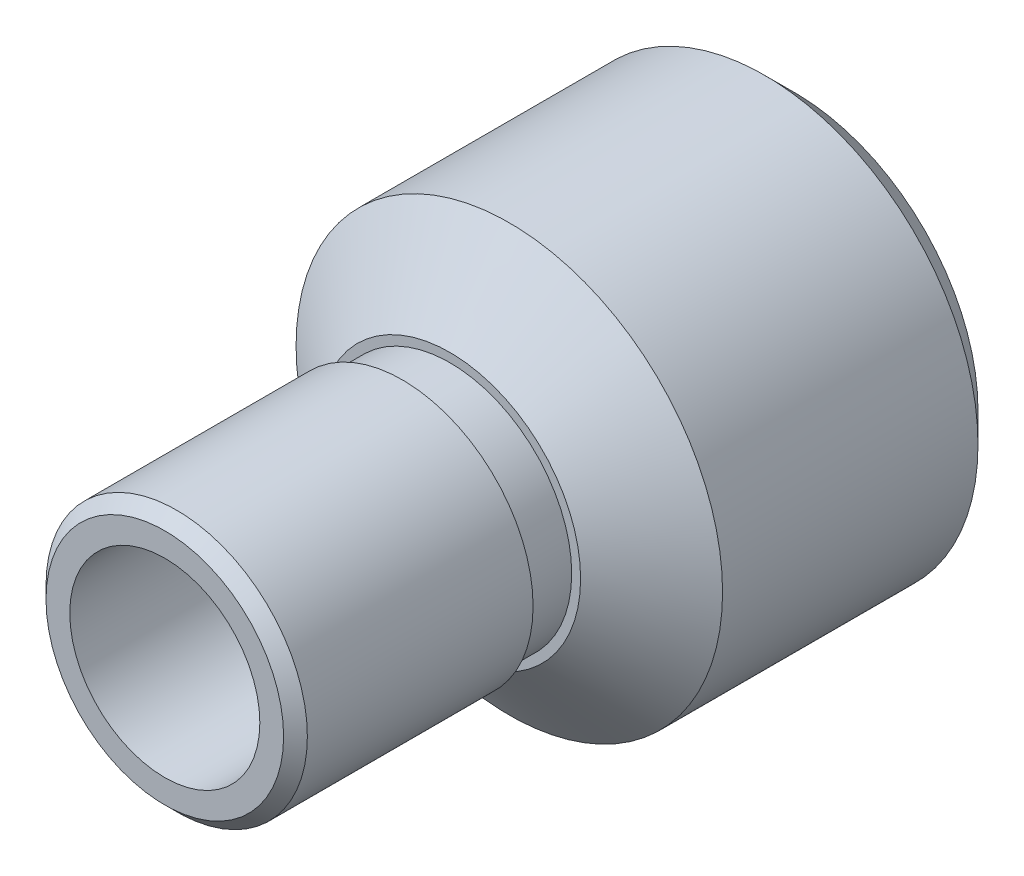
ISO-10303-21;
HEADER;
FILE_DESCRIPTION(('STEP AP214'),'2;1');
FILE_NAME('part.step','',(''),(''),'','','');
FILE_SCHEMA(('AUTOMOTIVE_DESIGN { 1 0 10303 214 1 1 1 1 }'));
ENDSEC;
DATA;
#1=APPLICATION_CONTEXT('core data for automotive mechanical design processes');
#2=APPLICATION_PROTOCOL_DEFINITION('international standard','automotive_design',2000,#1);
#3=PRODUCT_CONTEXT('',#1,'mechanical');
#4=PRODUCT('Part','Part','',(#3));
#5=PRODUCT_RELATED_PRODUCT_CATEGORY('part','',(#4));
#6=PRODUCT_DEFINITION_FORMATION('','',#4);
#7=PRODUCT_DEFINITION_CONTEXT('part definition',#1,'design');
#8=PRODUCT_DEFINITION('design','',#6,#7);
#9=PRODUCT_DEFINITION_SHAPE('','',#8);
#10=(LENGTH_UNIT() NAMED_UNIT(*) SI_UNIT(.MILLI.,.METRE.));
#11=(NAMED_UNIT(*) PLANE_ANGLE_UNIT() SI_UNIT($,.RADIAN.));
#12=(NAMED_UNIT(*) SI_UNIT($,.STERADIAN.) SOLID_ANGLE_UNIT());
#13=UNCERTAINTY_MEASURE_WITH_UNIT(LENGTH_MEASURE(1.E-05),#10,'distance_accuracy_value','');
#14=(GEOMETRIC_REPRESENTATION_CONTEXT(3) GLOBAL_UNCERTAINTY_ASSIGNED_CONTEXT((#13)) GLOBAL_UNIT_ASSIGNED_CONTEXT((#10,
#11,#12)) REPRESENTATION_CONTEXT('',''));
#15=CARTESIAN_POINT('',(0.,0.,0.));
#16=DIRECTION('',(0.,0.,1.));
#17=DIRECTION('',(1.,0.,0.));
#18=AXIS2_PLACEMENT_3D('',#15,#16,#17);
#19=CARTESIAN_POINT('',(0.,11.,0.));
#20=DIRECTION('',(0.,0.,-1.));
#21=DIRECTION('',(-1.,0.,0.));
#22=AXIS2_PLACEMENT_3D('',#19,#20,#21);
#23=PLANE('',#22);
#24=CARTESIAN_POINT('',(0.,0.,0.));
#25=DIRECTION('',(0.,0.,-1.));
#26=DIRECTION('',(-1.,0.,0.));
#27=AXIS2_PLACEMENT_3D('',#24,#25,#26);
#28=CIRCLE('',#27,9.99999999999999);
#29=CARTESIAN_POINT('',(-9.99999999999999,0.,0.));
#30=VERTEX_POINT('',#29);
#31=EDGE_CURVE('E40',#30,#30,#28,.F.);
#32=ORIENTED_EDGE('',*,*,#31,.T.);
#33=EDGE_LOOP('',(#32));
#34=FACE_BOUND('',#33,.T.);
#35=CARTESIAN_POINT('',(0.,0.,0.));
#36=DIRECTION('',(0.,0.,1.));
#37=DIRECTION('',(1.,0.,0.));
#38=AXIS2_PLACEMENT_3D('',#35,#36,#37);
#39=CIRCLE('',#38,8.);
#40=CARTESIAN_POINT('',(8.,0.,0.));
#41=VERTEX_POINT('',#40);
#42=EDGE_CURVE('E53',#41,#41,#39,.T.);
#43=ORIENTED_EDGE('',*,*,#42,.F.);
#44=EDGE_LOOP('',(#43));
#45=FACE_BOUND('',#44,.T.);
#46=ADVANCED_FACE('F33',(#34,#45),#23,.F.);
#47=CARTESIAN_POINT('',(0.,0.,0.));
#48=DIRECTION('',(0.,0.,1.));
#49=DIRECTION('',(1.,0.,0.));
#50=AXIS2_PLACEMENT_3D('',#47,#48,#49);
#51=CYLINDRICAL_SURFACE('',#50,8.);
#52=CARTESIAN_POINT('',(0.,0.,-25.5374192450481));
#53=DIRECTION('',(0.,0.,1.));
#54=DIRECTION('',(1.,0.,0.));
#55=AXIS2_PLACEMENT_3D('',#52,#53,#54);
#56=CIRCLE('',#55,8.);
#57=CARTESIAN_POINT('',(8.,0.,-25.5374192450481));
#58=VERTEX_POINT('',#57);
#59=EDGE_CURVE('E56',#58,#58,#56,.T.);
#60=ORIENTED_EDGE('',*,*,#59,.F.);
#61=EDGE_LOOP('',(#60));
#62=FACE_BOUND('',#61,.T.);
#63=ORIENTED_EDGE('',*,*,#42,.T.);
#64=EDGE_LOOP('',(#63));
#65=FACE_BOUND('',#64,.T.);
#66=ADVANCED_FACE('F111',(#62,#65),#51,.F.);
#67=CARTESIAN_POINT('',(0.,0.,-25.5374192450481));
#68=DIRECTION('',(0.,0.,-1.));
#69=DIRECTION('',(-1.,0.,0.));
#70=AXIS2_PLACEMENT_3D('',#67,#68,#69);
#71=CONICAL_SURFACE('',#70,8.,0.947152420719403);
#72=CARTESIAN_POINT('',(0.,0.,-30.5374192450481));
#73=DIRECTION('',(0.,0.,1.));
#74=DIRECTION('',(1.,0.,0.));
#75=AXIS2_PLACEMENT_3D('',#72,#73,#74);
#76=CIRCLE('',#75,14.95);
#77=CARTESIAN_POINT('',(14.95,0.,-30.5374192450481));
#78=VERTEX_POINT('',#77);
#79=EDGE_CURVE('E59',#78,#78,#76,.T.);
#80=ORIENTED_EDGE('',*,*,#79,.F.);
#81=EDGE_LOOP('',(#80));
#82=FACE_BOUND('',#81,.T.);
#83=ORIENTED_EDGE('',*,*,#59,.T.);
#84=EDGE_LOOP('',(#83));
#85=FACE_BOUND('',#84,.T.);
#86=ADVANCED_FACE('F118',(#82,#85),#71,.F.);
#87=CARTESIAN_POINT('',(0.,0.,0.));
#88=DIRECTION('',(0.,0.,1.));
#89=DIRECTION('',(1.,0.,0.));
#90=AXIS2_PLACEMENT_3D('',#87,#88,#89);
#91=CYLINDRICAL_SURFACE('',#90,14.95);
#92=CARTESIAN_POINT('',(0.,0.,-53.));
#93=DIRECTION('',(0.,0.,1.));
#94=DIRECTION('',(1.,0.,0.));
#95=AXIS2_PLACEMENT_3D('',#92,#93,#94);
#96=CIRCLE('',#95,14.95);
#97=CARTESIAN_POINT('',(14.95,0.,-53.));
#98=VERTEX_POINT('',#97);
#99=EDGE_CURVE('E62',#98,#98,#96,.T.);
#100=ORIENTED_EDGE('',*,*,#99,.F.);
#101=EDGE_LOOP('',(#100));
#102=FACE_BOUND('',#101,.T.);
#103=ORIENTED_EDGE('',*,*,#79,.T.);
#104=EDGE_LOOP('',(#103));
#105=FACE_BOUND('',#104,.T.);
#106=ADVANCED_FACE('F107',(#102,#105),#91,.F.);
#107=CARTESIAN_POINT('',(0.,17.95,-53.));
#108=DIRECTION('',(0.,0.,1.));
#109=DIRECTION('',(1.,0.,0.));
#110=AXIS2_PLACEMENT_3D('',#107,#108,#109);
#111=PLANE('',#110);
#112=CARTESIAN_POINT('',(0.,0.,-53.));
#113=DIRECTION('',(0.,0.,1.));
#114=DIRECTION('',(1.,0.,0.));
#115=AXIS2_PLACEMENT_3D('',#112,#113,#114);
#116=CIRCLE('',#115,15.45);
#117=CARTESIAN_POINT('',(15.45,0.,-53.));
#118=VERTEX_POINT('',#117);
#119=EDGE_CURVE('E44',#118,#118,#116,.F.);
#120=ORIENTED_EDGE('',*,*,#119,.T.);
#121=EDGE_LOOP('',(#120));
#122=FACE_BOUND('',#121,.T.);
#123=ORIENTED_EDGE('',*,*,#99,.T.);
#124=EDGE_LOOP('',(#123));
#125=FACE_BOUND('',#124,.T.);
#126=ADVANCED_FACE('F101',(#122,#125),#111,.F.);
#127=CARTESIAN_POINT('',(0.,0.,0.));
#128=DIRECTION('',(0.,0.,1.));
#129=DIRECTION('',(1.,0.,0.));
#130=AXIS2_PLACEMENT_3D('',#127,#128,#129);
#131=CYLINDRICAL_SURFACE('',#130,17.95);
#132=CARTESIAN_POINT('',(0.,0.,-50.5));
#133=DIRECTION('',(0.,0.,1.));
#134=DIRECTION('',(1.,0.,0.));
#135=AXIS2_PLACEMENT_3D('',#132,#133,#134);
#136=CIRCLE('',#135,17.95);
#137=CARTESIAN_POINT('',(17.95,0.,-50.5));
#138=VERTEX_POINT('',#137);
#139=EDGE_CURVE('E48',#138,#138,#136,.T.);
#140=ORIENTED_EDGE('',*,*,#139,.T.);
#141=EDGE_LOOP('',(#140));
#142=FACE_BOUND('',#141,.T.);
#143=CARTESIAN_POINT('',(0.,0.,-29.));
#144=DIRECTION('',(0.,0.,1.));
#145=DIRECTION('',(1.,0.,0.));
#146=AXIS2_PLACEMENT_3D('',#143,#144,#145);
#147=CIRCLE('',#146,17.95);
#148=CARTESIAN_POINT('',(17.95,0.,-29.));
#149=VERTEX_POINT('',#148);
#150=EDGE_CURVE('E65',#149,#149,#147,.T.);
#151=ORIENTED_EDGE('',*,*,#150,.F.);
#152=EDGE_LOOP('',(#151));
#153=FACE_BOUND('',#152,.T.);
#154=ADVANCED_FACE('F96',(#142,#153),#131,.T.);
#155=CARTESIAN_POINT('',(0.,0.,-29.));
#156=DIRECTION('',(0.,0.,-1.));
#157=DIRECTION('',(-1.,0.,0.));
#158=AXIS2_PLACEMENT_3D('',#155,#156,#157);
#159=CONICAL_SURFACE('',#158,17.95,0.947152420719404);
#160=CARTESIAN_POINT('',(0.,0.,-24.));
#161=DIRECTION('',(0.,0.,1.));
#162=DIRECTION('',(1.,0.,0.));
#163=AXIS2_PLACEMENT_3D('',#160,#161,#162);
#164=CIRCLE('',#163,11.);
#165=CARTESIAN_POINT('',(11.,0.,-24.));
#166=VERTEX_POINT('',#165);
#167=EDGE_CURVE('E68',#166,#166,#164,.T.);
#168=ORIENTED_EDGE('',*,*,#167,.F.);
#169=EDGE_LOOP('',(#168));
#170=FACE_BOUND('',#169,.T.);
#171=ORIENTED_EDGE('',*,*,#150,.T.);
#172=EDGE_LOOP('',(#171));
#173=FACE_BOUND('',#172,.T.);
#174=ADVANCED_FACE('F92',(#170,#173),#159,.T.);
#175=CARTESIAN_POINT('',(0.,0.,0.));
#176=DIRECTION('',(0.,0.,1.));
#177=DIRECTION('',(1.,0.,0.));
#178=AXIS2_PLACEMENT_3D('',#175,#176,#177);
#179=CYLINDRICAL_SURFACE('',#178,11.);
#180=CARTESIAN_POINT('',(0.,0.,-1.00000000000002));
#181=DIRECTION('',(0.,0.,-1.));
#182=DIRECTION('',(-1.,0.,0.));
#183=AXIS2_PLACEMENT_3D('',#180,#181,#182);
#184=CIRCLE('',#183,11.);
#185=CARTESIAN_POINT('',(-11.,0.,-1.00000000000002));
#186=VERTEX_POINT('',#185);
#187=EDGE_CURVE('E10',#186,#186,#184,.T.);
#188=ORIENTED_EDGE('',*,*,#187,.T.);
#189=EDGE_LOOP('',(#188));
#190=FACE_BOUND('',#189,.T.);
#191=CARTESIAN_POINT('',(0.,0.,-20.));
#192=DIRECTION('',(0.,0.,1.));
#193=DIRECTION('',(1.,0.,0.));
#194=AXIS2_PLACEMENT_3D('',#191,#192,#193);
#195=CIRCLE('',#194,11.);
#196=CARTESIAN_POINT('',(11.,0.,-20.));
#197=VERTEX_POINT('',#196);
#198=EDGE_CURVE('E69',#197,#197,#195,.T.);
#199=ORIENTED_EDGE('',*,*,#198,.T.);
#200=EDGE_LOOP('',(#199));
#201=FACE_BOUND('',#200,.T.);
#202=ADVANCED_FACE('F95',(#190,#201),#179,.T.);
#203=CARTESIAN_POINT('',(0.,0.,-50.5));
#204=DIRECTION('',(0.,0.,1.));
#205=DIRECTION('',(1.,0.,0.));
#206=AXIS2_PLACEMENT_3D('',#203,#204,#205);
#207=CONICAL_SURFACE('',#206,17.95,0.785398163397452);
#208=ORIENTED_EDGE('',*,*,#119,.F.);
#209=EDGE_LOOP('',(#208));
#210=FACE_BOUND('',#209,.T.);
#211=ORIENTED_EDGE('',*,*,#139,.F.);
#212=EDGE_LOOP('',(#211));
#213=FACE_BOUND('',#212,.T.);
#214=ADVANCED_FACE('F88',(#210,#213),#207,.T.);
#215=CARTESIAN_POINT('',(0.,0.,-24.));
#216=DIRECTION('',(0.,0.,1.));
#217=DIRECTION('',(1.,0.,0.));
#218=AXIS2_PLACEMENT_3D('',#215,#216,#217);
#219=PLANE('',#218);
#220=CARTESIAN_POINT('',(0.,0.,-24.));
#221=DIRECTION('',(0.,0.,1.));
#222=DIRECTION('',(1.,0.,0.));
#223=AXIS2_PLACEMENT_3D('',#220,#221,#222);
#224=CIRCLE('',#223,10.25);
#225=CARTESIAN_POINT('',(10.25,0.,-24.));
#226=VERTEX_POINT('',#225);
#227=EDGE_CURVE('E72',#226,#226,#224,.T.);
#228=ORIENTED_EDGE('',*,*,#227,.F.);
#229=EDGE_LOOP('',(#228));
#230=FACE_BOUND('',#229,.T.);
#231=ORIENTED_EDGE('',*,*,#167,.T.);
#232=EDGE_LOOP('',(#231));
#233=FACE_BOUND('',#232,.T.);
#234=ADVANCED_FACE('F84',(#230,#233),#219,.T.);
#235=CARTESIAN_POINT('',(0.,0.,-20.));
#236=DIRECTION('',(0.,0.,1.));
#237=DIRECTION('',(1.,0.,0.));
#238=AXIS2_PLACEMENT_3D('',#235,#236,#237);
#239=PLANE('',#238);
#240=CARTESIAN_POINT('',(0.,0.,-20.));
#241=DIRECTION('',(0.,0.,1.));
#242=DIRECTION('',(1.,0.,0.));
#243=AXIS2_PLACEMENT_3D('',#240,#241,#242);
#244=CIRCLE('',#243,10.25);
#245=CARTESIAN_POINT('',(10.25,0.,-20.));
#246=VERTEX_POINT('',#245);
#247=EDGE_CURVE('E75',#246,#246,#244,.T.);
#248=ORIENTED_EDGE('',*,*,#247,.T.);
#249=EDGE_LOOP('',(#248));
#250=FACE_BOUND('',#249,.T.);
#251=ORIENTED_EDGE('',*,*,#198,.F.);
#252=EDGE_LOOP('',(#251));
#253=FACE_BOUND('',#252,.T.);
#254=ADVANCED_FACE('F87',(#250,#253),#239,.F.);
#255=CARTESIAN_POINT('',(0.,0.,-24.));
#256=DIRECTION('',(0.,0.,1.));
#257=DIRECTION('',(1.,0.,0.));
#258=AXIS2_PLACEMENT_3D('',#255,#256,#257);
#259=CYLINDRICAL_SURFACE('',#258,10.25);
#260=ORIENTED_EDGE('',*,*,#227,.T.);
#261=EDGE_LOOP('',(#260));
#262=FACE_BOUND('',#261,.T.);
#263=ORIENTED_EDGE('',*,*,#247,.F.);
#264=EDGE_LOOP('',(#263));
#265=FACE_BOUND('',#264,.T.);
#266=ADVANCED_FACE('F81',(#262,#265),#259,.T.);
#267=CARTESIAN_POINT('',(0.,0.,0.));
#268=DIRECTION('',(0.,0.,-1.));
#269=DIRECTION('',(-1.,0.,0.));
#270=AXIS2_PLACEMENT_3D('',#267,#268,#269);
#271=CONICAL_SURFACE('',#270,9.99999999999999,0.785398163397447);
#272=ORIENTED_EDGE('',*,*,#187,.F.);
#273=EDGE_LOOP('',(#272));
#274=FACE_BOUND('',#273,.T.);
#275=ORIENTED_EDGE('',*,*,#31,.F.);
#276=EDGE_LOOP('',(#275));
#277=FACE_BOUND('',#276,.T.);
#278=ADVANCED_FACE('F35',(#274,#277),#271,.T.);
#279=CLOSED_SHELL('',(#46,#66,#86,#106,#126,#154,#174,#202,#214,#234,#254,#266,#278));
#280=MANIFOLD_SOLID_BREP('B2',#279);
#281=ADVANCED_BREP_SHAPE_REPRESENTATION('',(#18,#280),#14);
#282=SHAPE_DEFINITION_REPRESENTATION(#9,#281);
ENDSEC;
END-ISO-10303-21;
